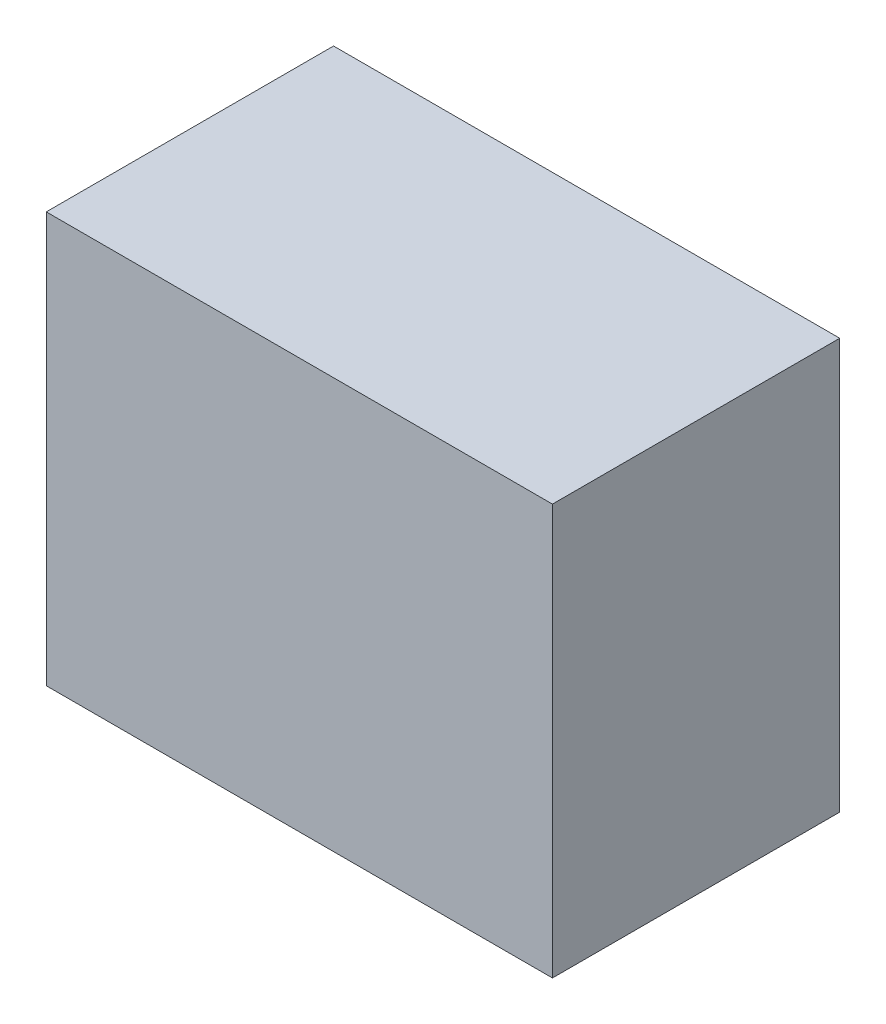
ISO-10303-21;
HEADER;
FILE_DESCRIPTION(('STEP AP214'),'2;1');
FILE_NAME('part.step','',(''),(''),'','','');
FILE_SCHEMA(('AUTOMOTIVE_DESIGN { 1 0 10303 214 1 1 1 1 }'));
ENDSEC;
DATA;
#1=APPLICATION_CONTEXT('core data for automotive mechanical design processes');
#2=APPLICATION_PROTOCOL_DEFINITION('international standard','automotive_design',2000,#1);
#3=PRODUCT_CONTEXT('',#1,'mechanical');
#4=PRODUCT('Part','Part','',(#3));
#5=PRODUCT_RELATED_PRODUCT_CATEGORY('part','',(#4));
#6=PRODUCT_DEFINITION_FORMATION('','',#4);
#7=PRODUCT_DEFINITION_CONTEXT('part definition',#1,'design');
#8=PRODUCT_DEFINITION('design','',#6,#7);
#9=PRODUCT_DEFINITION_SHAPE('','',#8);
#10=(LENGTH_UNIT() NAMED_UNIT(*) SI_UNIT(.MILLI.,.METRE.));
#11=(NAMED_UNIT(*) PLANE_ANGLE_UNIT() SI_UNIT($,.RADIAN.));
#12=(NAMED_UNIT(*) SI_UNIT($,.STERADIAN.) SOLID_ANGLE_UNIT());
#13=UNCERTAINTY_MEASURE_WITH_UNIT(LENGTH_MEASURE(1.E-05),#10,'distance_accuracy_value','');
#14=(GEOMETRIC_REPRESENTATION_CONTEXT(3) GLOBAL_UNCERTAINTY_ASSIGNED_CONTEXT((#13)) GLOBAL_UNIT_ASSIGNED_CONTEXT((#10,
#11,#12)) REPRESENTATION_CONTEXT('',''));
#15=CARTESIAN_POINT('',(0.,0.,0.));
#16=DIRECTION('',(0.,0.,1.));
#17=DIRECTION('',(1.,0.,0.));
#18=AXIS2_PLACEMENT_3D('',#15,#16,#17);
#19=CARTESIAN_POINT('',(1.84999884,-1.49999954,2.10000088));
#20=DIRECTION('',(0.,0.,1.));
#21=DIRECTION('',(1.,0.,0.));
#22=AXIS2_PLACEMENT_3D('',#19,#20,#21);
#23=PLANE('',#22);
#24=DIRECTION('',(0.,1.,0.));
#25=VECTOR('',#24,1.);
#26=CARTESIAN_POINT('',(-1.84999884,-1.49999954,2.10000088));
#27=LINE('',#26,#25);
#28=CARTESIAN_POINT('',(-1.84999884,-1.49999954,2.10000088));
#29=VERTEX_POINT('',#28);
#30=CARTESIAN_POINT('',(-1.84999884,1.49999954,2.10000088));
#31=VERTEX_POINT('',#30);
#32=EDGE_CURVE('E53',#29,#31,#27,.T.);
#33=ORIENTED_EDGE('',*,*,#32,.F.);
#34=DIRECTION('',(1.,0.,0.));
#35=VECTOR('',#34,1.);
#36=CARTESIAN_POINT('',(1.84999884,-1.49999954,2.10000088));
#37=LINE('',#36,#35);
#38=CARTESIAN_POINT('',(1.84999884,-1.49999954,2.10000088));
#39=VERTEX_POINT('',#38);
#40=EDGE_CURVE('E68',#39,#29,#37,.F.);
#41=ORIENTED_EDGE('',*,*,#40,.F.);
#42=DIRECTION('',(0.,1.,0.));
#43=VECTOR('',#42,1.);
#44=CARTESIAN_POINT('',(1.84999884,1.49999954,2.10000088));
#45=LINE('',#44,#43);
#46=CARTESIAN_POINT('',(1.84999884,1.49999954,2.10000088));
#47=VERTEX_POINT('',#46);
#48=EDGE_CURVE('E20',#47,#39,#45,.F.);
#49=ORIENTED_EDGE('',*,*,#48,.F.);
#50=DIRECTION('',(1.,0.,0.));
#51=VECTOR('',#50,1.);
#52=CARTESIAN_POINT('',(-1.84999884,1.49999954,2.10000088));
#53=LINE('',#52,#51);
#54=EDGE_CURVE('E58',#31,#47,#53,.T.);
#55=ORIENTED_EDGE('',*,*,#54,.F.);
#56=EDGE_LOOP('',(#33,#41,#49,#55));
#57=FACE_BOUND('',#56,.T.);
#58=ADVANCED_FACE('F17',(#57),#23,.T.);
#59=CARTESIAN_POINT('',(1.84999884,1.49999954,0.));
#60=DIRECTION('',(1.,0.,0.));
#61=DIRECTION('',(0.,0.,-1.));
#62=AXIS2_PLACEMENT_3D('',#59,#60,#61);
#63=PLANE('',#62);
#64=DIRECTION('',(0.,0.,-1.));
#65=VECTOR('',#64,1.);
#66=CARTESIAN_POINT('',(1.84999884,-1.49999954,0.));
#67=LINE('',#66,#65);
#68=CARTESIAN_POINT('',(1.84999884,-1.49999954,0.));
#69=VERTEX_POINT('',#68);
#70=EDGE_CURVE('E79',#69,#39,#67,.F.);
#71=ORIENTED_EDGE('',*,*,#70,.F.);
#72=DIRECTION('',(0.,1.,0.));
#73=VECTOR('',#72,1.);
#74=CARTESIAN_POINT('',(1.84999884,-1.49999954,0.));
#75=LINE('',#74,#73);
#76=CARTESIAN_POINT('',(1.84999884,1.49999954,0.));
#77=VERTEX_POINT('',#76);
#78=EDGE_CURVE('E74',#69,#77,#75,.T.);
#79=ORIENTED_EDGE('',*,*,#78,.T.);
#80=DIRECTION('',(0.,0.,1.));
#81=VECTOR('',#80,1.);
#82=CARTESIAN_POINT('',(1.84999884,1.49999954,0.));
#83=LINE('',#82,#81);
#84=EDGE_CURVE('E63',#47,#77,#83,.F.);
#85=ORIENTED_EDGE('',*,*,#84,.F.);
#86=ORIENTED_EDGE('',*,*,#48,.T.);
#87=EDGE_LOOP('',(#71,#79,#85,#86));
#88=FACE_BOUND('',#87,.T.);
#89=ADVANCED_FACE('F73',(#88),#63,.T.);
#90=CARTESIAN_POINT('',(-1.84999884,1.49999954,0.));
#91=DIRECTION('',(0.,1.,0.));
#92=DIRECTION('',(0.,0.,1.));
#93=AXIS2_PLACEMENT_3D('',#90,#91,#92);
#94=PLANE('',#93);
#95=ORIENTED_EDGE('',*,*,#84,.T.);
#96=DIRECTION('',(1.,0.,0.));
#97=VECTOR('',#96,1.);
#98=CARTESIAN_POINT('',(1.84999884,1.49999954,0.));
#99=LINE('',#98,#97);
#100=CARTESIAN_POINT('',(-1.84999884,1.49999954,0.));
#101=VERTEX_POINT('',#100);
#102=EDGE_CURVE('E84',#77,#101,#99,.F.);
#103=ORIENTED_EDGE('',*,*,#102,.T.);
#104=DIRECTION('',(0.,0.,1.));
#105=VECTOR('',#104,1.);
#106=CARTESIAN_POINT('',(-1.84999884,1.49999954,0.));
#107=LINE('',#106,#105);
#108=EDGE_CURVE('E65',#31,#101,#107,.F.);
#109=ORIENTED_EDGE('',*,*,#108,.F.);
#110=ORIENTED_EDGE('',*,*,#54,.T.);
#111=EDGE_LOOP('',(#95,#103,#109,#110));
#112=FACE_BOUND('',#111,.T.);
#113=ADVANCED_FACE('F60',(#112),#94,.T.);
#114=CARTESIAN_POINT('',(-1.84999884,-1.49999954,0.));
#115=DIRECTION('',(-1.,0.,0.));
#116=DIRECTION('',(0.,0.,1.));
#117=AXIS2_PLACEMENT_3D('',#114,#115,#116);
#118=PLANE('',#117);
#119=ORIENTED_EDGE('',*,*,#108,.T.);
#120=DIRECTION('',(0.,1.,0.));
#121=VECTOR('',#120,1.);
#122=CARTESIAN_POINT('',(-1.84999884,-1.49999954,0.));
#123=LINE('',#122,#121);
#124=CARTESIAN_POINT('',(-1.84999884,-1.49999954,0.));
#125=VERTEX_POINT('',#124);
#126=EDGE_CURVE('E26',#101,#125,#123,.F.);
#127=ORIENTED_EDGE('',*,*,#126,.T.);
#128=DIRECTION('',(0.,0.,-1.));
#129=VECTOR('',#128,1.);
#130=CARTESIAN_POINT('',(-1.84999884,-1.49999954,0.));
#131=LINE('',#130,#129);
#132=EDGE_CURVE('E34',#29,#125,#131,.T.);
#133=ORIENTED_EDGE('',*,*,#132,.F.);
#134=ORIENTED_EDGE('',*,*,#32,.T.);
#135=EDGE_LOOP('',(#119,#127,#133,#134));
#136=FACE_BOUND('',#135,.T.);
#137=ADVANCED_FACE('F88',(#136),#118,.T.);
#138=CARTESIAN_POINT('',(1.84999884,-1.49999954,0.));
#139=DIRECTION('',(0.,-1.,0.));
#140=DIRECTION('',(0.,0.,-1.));
#141=AXIS2_PLACEMENT_3D('',#138,#139,#140);
#142=PLANE('',#141);
#143=ORIENTED_EDGE('',*,*,#132,.T.);
#144=DIRECTION('',(1.,0.,0.));
#145=VECTOR('',#144,1.);
#146=CARTESIAN_POINT('',(1.84999884,-1.49999954,0.));
#147=LINE('',#146,#145);
#148=EDGE_CURVE('E11',#125,#69,#147,.T.);
#149=ORIENTED_EDGE('',*,*,#148,.T.);
#150=ORIENTED_EDGE('',*,*,#70,.T.);
#151=ORIENTED_EDGE('',*,*,#40,.T.);
#152=EDGE_LOOP('',(#143,#149,#150,#151));
#153=FACE_BOUND('',#152,.T.);
#154=ADVANCED_FACE('F91',(#153),#142,.T.);
#155=CARTESIAN_POINT('',(1.84999884,-1.49999954,0.));
#156=DIRECTION('',(0.,0.,1.));
#157=DIRECTION('',(1.,0.,0.));
#158=AXIS2_PLACEMENT_3D('',#155,#156,#157);
#159=PLANE('',#158);
#160=ORIENTED_EDGE('',*,*,#126,.F.);
#161=ORIENTED_EDGE('',*,*,#102,.F.);
#162=ORIENTED_EDGE('',*,*,#78,.F.);
#163=ORIENTED_EDGE('',*,*,#148,.F.);
#164=EDGE_LOOP('',(#160,#161,#162,#163));
#165=FACE_BOUND('',#164,.T.);
#166=ADVANCED_FACE('F90',(#165),#159,.F.);
#167=CLOSED_SHELL('',(#58,#89,#113,#137,#154,#166));
#168=MANIFOLD_SOLID_BREP('B1',#167);
#169=ADVANCED_BREP_SHAPE_REPRESENTATION('',(#18,#168),#14);
#170=SHAPE_DEFINITION_REPRESENTATION(#9,#169);
ENDSEC;
END-ISO-10303-21;
